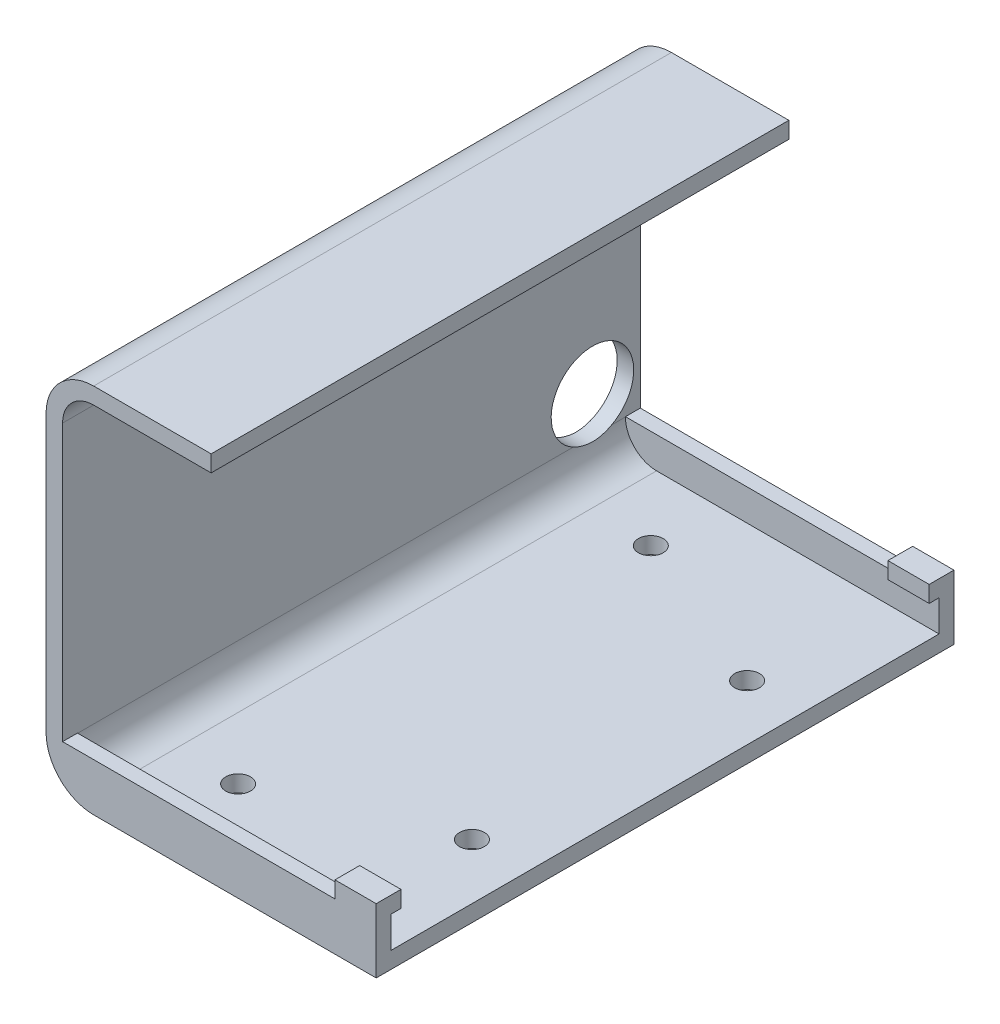
ISO-10303-21;
HEADER;
FILE_DESCRIPTION(('STEP AP214'),'2;1');
FILE_NAME('part.step','',(''),(''),'','','');
FILE_SCHEMA(('AUTOMOTIVE_DESIGN { 1 0 10303 214 1 1 1 1 }'));
ENDSEC;
DATA;
#1=APPLICATION_CONTEXT('core data for automotive mechanical design processes');
#2=APPLICATION_PROTOCOL_DEFINITION('international standard','automotive_design',2000,#1);
#3=PRODUCT_CONTEXT('',#1,'mechanical');
#4=PRODUCT('Part','Part','',(#3));
#5=PRODUCT_RELATED_PRODUCT_CATEGORY('part','',(#4));
#6=PRODUCT_DEFINITION_FORMATION('','',#4);
#7=PRODUCT_DEFINITION_CONTEXT('part definition',#1,'design');
#8=PRODUCT_DEFINITION('design','',#6,#7);
#9=PRODUCT_DEFINITION_SHAPE('','',#8);
#10=(LENGTH_UNIT() NAMED_UNIT(*) SI_UNIT(.MILLI.,.METRE.));
#11=(NAMED_UNIT(*) PLANE_ANGLE_UNIT() SI_UNIT($,.RADIAN.));
#12=(NAMED_UNIT(*) SI_UNIT($,.STERADIAN.) SOLID_ANGLE_UNIT());
#13=UNCERTAINTY_MEASURE_WITH_UNIT(LENGTH_MEASURE(1.E-05),#10,'distance_accuracy_value','');
#14=(GEOMETRIC_REPRESENTATION_CONTEXT(3) GLOBAL_UNCERTAINTY_ASSIGNED_CONTEXT((#13)) GLOBAL_UNIT_ASSIGNED_CONTEXT((#10,
#11,#12)) REPRESENTATION_CONTEXT('',''));
#15=CARTESIAN_POINT('',(0.,0.,0.));
#16=DIRECTION('',(0.,0.,1.));
#17=DIRECTION('',(1.,0.,0.));
#18=AXIS2_PLACEMENT_3D('',#15,#16,#17);
#19=CARTESIAN_POINT('',(-30.4002300884953,-13.4655752212389,0.));
#20=DIRECTION('',(0.,1.,0.));
#21=DIRECTION('',(0.,0.,1.));
#22=AXIS2_PLACEMENT_3D('',#19,#20,#21);
#23=PLANE('',#22);
#24=DIRECTION('',(1.,0.,0.));
#25=VECTOR('',#24,1.);
#26=CARTESIAN_POINT('',(-30.4002300884953,-13.4655752212389,1.8));
#27=LINE('',#26,#25);
#28=CARTESIAN_POINT('',(-28.3982300884955,-13.4655752212389,1.8));
#29=VERTEX_POINT('',#28);
#30=CARTESIAN_POINT('',(4.60176991150454,-13.4655752212389,1.8));
#31=VERTEX_POINT('',#30);
#32=EDGE_CURVE('E409',#29,#31,#27,.T.);
#33=ORIENTED_EDGE('',*,*,#32,.T.);
#34=DIRECTION('',(0.,0.,1.));
#35=VECTOR('',#34,1.);
#36=CARTESIAN_POINT('',(4.60176991150454,-13.4655752212389,0.));
#37=LINE('',#36,#35);
#38=CARTESIAN_POINT('',(4.60176991150455,-13.4655752212389,0.));
#39=VERTEX_POINT('',#38);
#40=EDGE_CURVE('E357',#39,#31,#37,.T.);
#41=ORIENTED_EDGE('',*,*,#40,.F.);
#42=DIRECTION('',(1.,0.,0.));
#43=VECTOR('',#42,1.);
#44=CARTESIAN_POINT('',(-30.4002300884953,-13.4655752212389,0.));
#45=LINE('',#44,#43);
#46=CARTESIAN_POINT('',(-28.3982300884955,-13.4655752212389,0.));
#47=VERTEX_POINT('',#46);
#48=EDGE_CURVE('E267',#47,#39,#45,.T.);
#49=ORIENTED_EDGE('',*,*,#48,.F.);
#50=DIRECTION('',(0.,0.,1.));
#51=VECTOR('',#50,1.);
#52=CARTESIAN_POINT('',(-28.3982300884955,-13.4655752212389,0.));
#53=LINE('',#52,#51);
#54=EDGE_CURVE('E262',#47,#29,#53,.T.);
#55=ORIENTED_EDGE('',*,*,#54,.T.);
#56=EDGE_LOOP('',(#33,#41,#49,#55));
#57=FACE_BOUND('',#56,.T.);
#58=ADVANCED_FACE('F33',(#57),#23,.T.);
#59=CARTESIAN_POINT('',(-30.4002300884953,-13.4655752212389,70.));
#60=DIRECTION('',(0.,1.,0.));
#61=DIRECTION('',(0.,0.,1.));
#62=AXIS2_PLACEMENT_3D('',#59,#60,#61);
#63=PLANE('',#62);
#64=DIRECTION('',(1.,0.,0.));
#65=VECTOR('',#64,1.);
#66=CARTESIAN_POINT('',(-30.4002300884953,-13.4655752212389,70.));
#67=LINE('',#66,#65);
#68=CARTESIAN_POINT('',(-28.3982300884955,-13.4655752212389,70.));
#69=VERTEX_POINT('',#68);
#70=CARTESIAN_POINT('',(4.60176991150454,-13.4655752212389,70.));
#71=VERTEX_POINT('',#70);
#72=EDGE_CURVE('E280',#69,#71,#67,.T.);
#73=ORIENTED_EDGE('',*,*,#72,.T.);
#74=DIRECTION('',(0.,0.,1.));
#75=VECTOR('',#74,1.);
#76=CARTESIAN_POINT('',(4.60176991150454,-13.4655752212389,70.));
#77=LINE('',#76,#75);
#78=CARTESIAN_POINT('',(4.60176991150454,-13.4655752212389,68.2));
#79=VERTEX_POINT('',#78);
#80=EDGE_CURVE('E394',#79,#71,#77,.T.);
#81=ORIENTED_EDGE('',*,*,#80,.F.);
#82=DIRECTION('',(1.,0.,0.));
#83=VECTOR('',#82,1.);
#84=CARTESIAN_POINT('',(-30.4002300884953,-13.4655752212389,68.2));
#85=LINE('',#84,#83);
#86=CARTESIAN_POINT('',(-28.3982300884955,-13.4655752212389,68.2));
#87=VERTEX_POINT('',#86);
#88=EDGE_CURVE('E283',#87,#79,#85,.T.);
#89=ORIENTED_EDGE('',*,*,#88,.F.);
#90=DIRECTION('',(0.,0.,1.));
#91=VECTOR('',#90,1.);
#92=CARTESIAN_POINT('',(-28.3982300884955,-13.4655752212389,70.));
#93=LINE('',#92,#91);
#94=EDGE_CURVE('E273',#87,#69,#93,.T.);
#95=ORIENTED_EDGE('',*,*,#94,.T.);
#96=EDGE_LOOP('',(#73,#81,#89,#95));
#97=FACE_BOUND('',#96,.T.);
#98=ADVANCED_FACE('F442',(#97),#63,.T.);
#99=CARTESIAN_POINT('',(9.60176991150455,-19.2655752212389,70.));
#100=DIRECTION('',(-1.,0.,0.));
#101=DIRECTION('',(0.,0.,1.));
#102=AXIS2_PLACEMENT_3D('',#99,#100,#101);
#103=PLANE('',#102);
#104=DIRECTION('',(0.,1.,0.));
#105=VECTOR('',#104,1.);
#106=CARTESIAN_POINT('',(9.60176991150455,-19.2655752212389,0.));
#107=LINE('',#106,#105);
#108=CARTESIAN_POINT('',(9.60176991150455,-19.2655752212389,0.));
#109=VERTEX_POINT('',#108);
#110=CARTESIAN_POINT('',(9.60176991150455,-11.4655752212389,0.));
#111=VERTEX_POINT('',#110);
#112=EDGE_CURVE('E279',#109,#111,#107,.T.);
#113=ORIENTED_EDGE('',*,*,#112,.T.);
#114=DIRECTION('',(0.,0.,-1.));
#115=VECTOR('',#114,1.);
#116=CARTESIAN_POINT('',(9.60176991150455,-11.4655752212389,0.));
#117=LINE('',#116,#115);
#118=CARTESIAN_POINT('',(9.60176991150455,-11.4655752212389,3.));
#119=VERTEX_POINT('',#118);
#120=EDGE_CURVE('E347',#119,#111,#117,.T.);
#121=ORIENTED_EDGE('',*,*,#120,.F.);
#122=DIRECTION('',(0.,-1.,0.));
#123=VECTOR('',#122,1.);
#124=CARTESIAN_POINT('',(9.60176991150455,-11.4655752212389,3.));
#125=LINE('',#124,#123);
#126=CARTESIAN_POINT('',(9.60176991150455,-13.4655752212389,3.));
#127=VERTEX_POINT('',#126);
#128=EDGE_CURVE('E350',#119,#127,#125,.T.);
#129=ORIENTED_EDGE('',*,*,#128,.T.);
#130=DIRECTION('',(0.,0.,-1.));
#131=VECTOR('',#130,1.);
#132=CARTESIAN_POINT('',(9.60176991150455,-13.4655752212389,0.));
#133=LINE('',#132,#131);
#134=CARTESIAN_POINT('',(9.60176991150455,-13.4655752212389,1.8));
#135=VERTEX_POINT('',#134);
#136=EDGE_CURVE('E366',#127,#135,#133,.T.);
#137=ORIENTED_EDGE('',*,*,#136,.T.);
#138=DIRECTION('',(0.,-1.,0.));
#139=VECTOR('',#138,1.);
#140=CARTESIAN_POINT('',(9.60176991150455,-17.2655752212389,1.8));
#141=LINE('',#140,#139);
#142=CARTESIAN_POINT('',(9.60176991150455,-17.2655752212389,1.8));
#143=VERTEX_POINT('',#142);
#144=EDGE_CURVE('E405',#135,#143,#141,.T.);
#145=ORIENTED_EDGE('',*,*,#144,.T.);
#146=DIRECTION('',(0.,0.,-1.));
#147=VECTOR('',#146,1.);
#148=CARTESIAN_POINT('',(9.60176991150455,-17.2655752212389,70.));
#149=LINE('',#148,#147);
#150=CARTESIAN_POINT('',(9.60176991150455,-17.2655752212389,68.2));
#151=VERTEX_POINT('',#150);
#152=EDGE_CURVE('E11',#151,#143,#149,.T.);
#153=ORIENTED_EDGE('',*,*,#152,.F.);
#154=DIRECTION('',(0.,1.,0.));
#155=VECTOR('',#154,1.);
#156=CARTESIAN_POINT('',(9.60176991150455,-17.2655752212389,68.2));
#157=LINE('',#156,#155);
#158=CARTESIAN_POINT('',(9.60176991150455,-13.4655752212389,68.2));
#159=VERTEX_POINT('',#158);
#160=EDGE_CURVE('E276',#151,#159,#157,.T.);
#161=ORIENTED_EDGE('',*,*,#160,.T.);
#162=DIRECTION('',(0.,0.,-1.));
#163=VECTOR('',#162,1.);
#164=CARTESIAN_POINT('',(9.60176991150455,-13.4655752212389,70.));
#165=LINE('',#164,#163);
#166=CARTESIAN_POINT('',(9.60176991150455,-13.4655752212389,67.));
#167=VERTEX_POINT('',#166);
#168=EDGE_CURVE('E378',#159,#167,#165,.T.);
#169=ORIENTED_EDGE('',*,*,#168,.T.);
#170=DIRECTION('',(0.,-1.,0.));
#171=VECTOR('',#170,1.);
#172=CARTESIAN_POINT('',(9.60176991150455,-11.4655752212389,67.));
#173=LINE('',#172,#171);
#174=CARTESIAN_POINT('',(9.60176991150455,-11.4655752212389,67.));
#175=VERTEX_POINT('',#174);
#176=EDGE_CURVE('E402',#175,#167,#173,.T.);
#177=ORIENTED_EDGE('',*,*,#176,.F.);
#178=DIRECTION('',(0.,0.,-1.));
#179=VECTOR('',#178,1.);
#180=CARTESIAN_POINT('',(9.60176991150455,-11.4655752212389,70.));
#181=LINE('',#180,#179);
#182=CARTESIAN_POINT('',(9.60176991150455,-11.4655752212389,70.));
#183=VERTEX_POINT('',#182);
#184=EDGE_CURVE('E379',#183,#175,#181,.T.);
#185=ORIENTED_EDGE('',*,*,#184,.F.);
#186=DIRECTION('',(0.,1.,0.));
#187=VECTOR('',#186,1.);
#188=CARTESIAN_POINT('',(9.60176991150455,-19.2655752212389,70.));
#189=LINE('',#188,#187);
#190=CARTESIAN_POINT('',(9.60176991150455,-19.2655752212389,70.));
#191=VERTEX_POINT('',#190);
#192=EDGE_CURVE('E288',#191,#183,#189,.T.);
#193=ORIENTED_EDGE('',*,*,#192,.F.);
#194=DIRECTION('',(0.,0.,-1.));
#195=VECTOR('',#194,1.);
#196=CARTESIAN_POINT('',(9.60176991150455,-19.2655752212389,70.));
#197=LINE('',#196,#195);
#198=EDGE_CURVE('E308',#191,#109,#197,.T.);
#199=ORIENTED_EDGE('',*,*,#198,.T.);
#200=EDGE_LOOP('',(#113,#121,#129,#137,#145,#153,#161,#169,#177,#185,#193,#199));
#201=FACE_BOUND('',#200,.T.);
#202=ADVANCED_FACE('F35',(#201),#103,.F.);
#203=CARTESIAN_POINT('',(-24.6282300884955,-17.2655752212389,70.));
#204=DIRECTION('',(0.,-1.,0.));
#205=DIRECTION('',(0.,0.,-1.));
#206=AXIS2_PLACEMENT_3D('',#203,#204,#205);
#207=PLANE('',#206);
#208=CARTESIAN_POINT('',(-17.1282300884954,-17.2655752212389,60.));
#209=DIRECTION('',(0.,-1.,0.));
#210=DIRECTION('',(0.,0.,-1.));
#211=AXIS2_PLACEMENT_3D('',#208,#209,#210);
#212=CIRCLE('',#211,1.5);
#213=CARTESIAN_POINT('',(-17.1282300884954,-17.2655752212389,58.5));
#214=VERTEX_POINT('',#213);
#215=EDGE_CURVE('E369',#214,#214,#212,.F.);
#216=ORIENTED_EDGE('',*,*,#215,.F.);
#217=EDGE_LOOP('',(#216));
#218=FACE_BOUND('',#217,.T.);
#219=CARTESIAN_POINT('',(2.87176991150455,-17.2655752212389,18.33));
#220=DIRECTION('',(0.,-1.,0.));
#221=DIRECTION('',(0.,0.,-1.));
#222=AXIS2_PLACEMENT_3D('',#219,#220,#221);
#223=CIRCLE('',#222,1.5);
#224=CARTESIAN_POINT('',(2.87176991150455,-17.2655752212389,16.83));
#225=VERTEX_POINT('',#224);
#226=EDGE_CURVE('E769',#225,#225,#223,.F.);
#227=ORIENTED_EDGE('',*,*,#226,.F.);
#228=EDGE_LOOP('',(#227));
#229=FACE_BOUND('',#228,.T.);
#230=CARTESIAN_POINT('',(2.87176991150455,-17.2655752212389,51.67));
#231=DIRECTION('',(0.,-1.,0.));
#232=DIRECTION('',(0.,0.,-1.));
#233=AXIS2_PLACEMENT_3D('',#230,#231,#232);
#234=CIRCLE('',#233,1.5);
#235=CARTESIAN_POINT('',(2.87176991150455,-17.2655752212389,50.17));
#236=VERTEX_POINT('',#235);
#237=EDGE_CURVE('E360',#236,#236,#234,.F.);
#238=ORIENTED_EDGE('',*,*,#237,.F.);
#239=EDGE_LOOP('',(#238));
#240=FACE_BOUND('',#239,.T.);
#241=CARTESIAN_POINT('',(-17.1282300884954,-17.2655752212389,10.));
#242=DIRECTION('',(0.,-1.,0.));
#243=DIRECTION('',(0.,0.,-1.));
#244=AXIS2_PLACEMENT_3D('',#241,#242,#243);
#245=CIRCLE('',#244,1.5);
#246=CARTESIAN_POINT('',(-17.1282300884954,-17.2655752212389,8.5));
#247=VERTEX_POINT('',#246);
#248=EDGE_CURVE('E775',#247,#247,#245,.F.);
#249=ORIENTED_EDGE('',*,*,#248,.F.);
#250=EDGE_LOOP('',(#249));
#251=FACE_BOUND('',#250,.T.);
#252=ORIENTED_EDGE('',*,*,#152,.T.);
#253=DIRECTION('',(1.,0.,0.));
#254=VECTOR('',#253,1.);
#255=CARTESIAN_POINT('',(-30.4002300884953,-17.2655752212389,1.8));
#256=LINE('',#255,#254);
#257=CARTESIAN_POINT('',(-24.6282300884955,-17.2655752212389,1.8));
#258=VERTEX_POINT('',#257);
#259=EDGE_CURVE('E258',#258,#143,#256,.T.);
#260=ORIENTED_EDGE('',*,*,#259,.F.);
#261=DIRECTION('',(0.,0.,-1.));
#262=VECTOR('',#261,1.);
#263=CARTESIAN_POINT('',(-24.6282300884955,-17.2655752212389,70.));
#264=LINE('',#263,#262);
#265=CARTESIAN_POINT('',(-24.6282300884955,-17.2655752212389,68.2));
#266=VERTEX_POINT('',#265);
#267=EDGE_CURVE('E41',#266,#258,#264,.T.);
#268=ORIENTED_EDGE('',*,*,#267,.F.);
#269=DIRECTION('',(1.,0.,0.));
#270=VECTOR('',#269,1.);
#271=CARTESIAN_POINT('',(-30.4002300884953,-17.2655752212389,68.2));
#272=LINE('',#271,#270);
#273=EDGE_CURVE('E275',#266,#151,#272,.T.);
#274=ORIENTED_EDGE('',*,*,#273,.T.);
#275=EDGE_LOOP('',(#252,#260,#268,#274));
#276=FACE_BOUND('',#275,.T.);
#277=ADVANCED_FACE('F425',(#218,#229,#240,#251,#276),#207,.F.);
#278=CARTESIAN_POINT('',(-24.6282300884955,-13.4955752212389,70.));
#279=DIRECTION('',(0.,0.,-1.));
#280=DIRECTION('',(-1.,0.,0.));
#281=AXIS2_PLACEMENT_3D('',#278,#279,#280);
#282=CYLINDRICAL_SURFACE('',#281,3.77);
#283=DIRECTION('',(0.,0.,-1.));
#284=VECTOR('',#283,1.);
#285=CARTESIAN_POINT('',(-28.3982300884955,-13.495575221239,70.));
#286=LINE('',#285,#284);
#287=CARTESIAN_POINT('',(-28.3982300884955,-13.495575221239,3.48157380967123));
#288=VERTEX_POINT('',#287);
#289=CARTESIAN_POINT('',(-28.3982300884955,-13.495575221239,1.8));
#290=VERTEX_POINT('',#289);
#291=EDGE_CURVE('E237',#288,#290,#286,.T.);
#292=ORIENTED_EDGE('',*,*,#291,.F.);
#293=CARTESIAN_POINT('',(-28.3982300884955,-13.4955752212389,8.11842619032883));
#294=CARTESIAN_POINT('',(-28.3982270925849,-13.5329839061099,8.0469465204507));
#295=CARTESIAN_POINT('',(-28.3976737369525,-13.5686546282551,7.97457569154834));
#296=CARTESIAN_POINT('',(-28.3957503176672,-13.6364479279596,7.82820827118018));
#297=CARTESIAN_POINT('',(-28.3943803223018,-13.6685708019244,7.75421181614778));
#298=CARTESIAN_POINT('',(-28.3894718258194,-13.7595057410542,7.53003158764738));
#299=CARTESIAN_POINT('',(-28.3851345778763,-13.8128996716182,7.37762722589878));
#300=CARTESIAN_POINT('',(-28.376260492181,-13.9045787019045,7.06882967974202));
#301=CARTESIAN_POINT('',(-28.371724228968,-13.9429044738165,6.91244846311666));
#302=CARTESIAN_POINT('',(-28.3638763128791,-14.0043105062385,6.59670763319707));
#303=CARTESIAN_POINT('',(-28.3605643929575,-14.0273940921363,6.43734867736293));
#304=CARTESIAN_POINT('',(-28.3563458061281,-14.0561353772264,6.13762455868667));
#305=CARTESIAN_POINT('',(-28.3551856647735,-14.0636443868979,5.99743723295872));
#306=CARTESIAN_POINT('',(-28.3546959175897,-14.0668520798259,5.71692660585075));
#307=CARTESIAN_POINT('',(-28.3553662228122,-14.062551336962,5.5766033114092));
#308=CARTESIAN_POINT('',(-28.3584085614522,-14.0421784010051,5.29695600951428));
#309=CARTESIAN_POINT('',(-28.3607790609137,-14.0261168185501,5.15763121555012));
#310=CARTESIAN_POINT('',(-28.3667335250392,-13.9823712810132,4.88089486437861));
#311=CARTESIAN_POINT('',(-28.3703172944029,-13.9546891963138,4.74348300295014));
#312=CARTESIAN_POINT('',(-28.3795751586933,-13.8733078305142,4.41216593684066));
#313=CARTESIAN_POINT('',(-28.3854800563474,-13.8135285565161,4.21970936348684));
#314=CARTESIAN_POINT('',(-28.3924702719276,-13.7068656230663,3.93759410397247));
#315=CARTESIAN_POINT('',(-28.39448916005,-13.6684787698263,3.84465022549217));
#316=CARTESIAN_POINT('',(-28.3973658913933,-13.5861561746786,3.66120388839466));
#317=CARTESIAN_POINT('',(-28.3982234018933,-13.5422188465655,3.57070213669266));
#318=CARTESIAN_POINT('',(-28.3982300884955,-13.4955752212389,3.48157380967117));
#319=B_SPLINE_CURVE_WITH_KNOTS('',3,(#293,#294,#295,#296,#297,#298,#299,#300,#301,#302,#303,
#304,#305,#306,#307,#308,#309,#310,#311,#312,#313,#314,#315,#316,#317,#318),.UNSPECIFIED.,.F.,
.F.,(4,2,2,2,2,2,2,2,2,2,2,2,4),(0.,0.241974503769225,0.48392877642466,0.967737118789775,
1.45023044277071,1.93261846636979,2.35330276719538,2.77396662577662,3.19425142800732,
3.61446860904911,4.21762328133169,4.51920325498638,4.82086960946777),.UNSPECIFIED.);
#320=CARTESIAN_POINT('',(-28.3982300884955,-13.495575221239,8.11842619032876));
#321=VERTEX_POINT('',#320);
#322=EDGE_CURVE('E47',#321,#288,#319,.T.);
#323=ORIENTED_EDGE('',*,*,#322,.F.);
#324=CARTESIAN_POINT('',(-28.3982300884955,-13.4955752212389,68.2));
#325=VERTEX_POINT('',#324);
#326=EDGE_CURVE('E238',#325,#321,#286,.T.);
#327=ORIENTED_EDGE('',*,*,#326,.F.);
#328=CARTESIAN_POINT('',(-24.6282300884955,-13.4955752212389,68.2));
#329=DIRECTION('',(0.,0.,-1.));
#330=DIRECTION('',(-1.,0.,0.));
#331=AXIS2_PLACEMENT_3D('',#328,#329,#330);
#332=CIRCLE('',#331,3.77);
#333=EDGE_CURVE('E251',#266,#325,#332,.T.);
#334=ORIENTED_EDGE('',*,*,#333,.F.);
#335=ORIENTED_EDGE('',*,*,#267,.T.);
#336=CARTESIAN_POINT('',(-24.6282300884955,-13.4955752212389,1.8));
#337=DIRECTION('',(0.,0.,1.));
#338=DIRECTION('',(1.,0.,0.));
#339=AXIS2_PLACEMENT_3D('',#336,#337,#338);
#340=CIRCLE('',#339,3.77);
#341=EDGE_CURVE('E248',#290,#258,#340,.T.);
#342=ORIENTED_EDGE('',*,*,#341,.F.);
#343=EDGE_LOOP('',(#292,#323,#327,#334,#335,#342));
#344=FACE_BOUND('',#343,.T.);
#345=ADVANCED_FACE('F247',(#344),#282,.F.);
#346=CARTESIAN_POINT('',(-28.3982300884954,19.9644247787611,70.));
#347=DIRECTION('',(-1.,0.,0.));
#348=DIRECTION('',(0.,-1.,0.));
#349=AXIS2_PLACEMENT_3D('',#346,#347,#348);
#350=PLANE('',#349);
#351=ORIENTED_EDGE('',*,*,#326,.T.);
#352=CARTESIAN_POINT('',(-28.3982300884955,-9.06557522123924,5.8));
#353=DIRECTION('',(-1.,0.,0.));
#354=DIRECTION('',(0.,-1.,0.));
#355=AXIS2_PLACEMENT_3D('',#352,#353,#354);
#356=CIRCLE('',#355,5.);
#357=EDGE_CURVE('E792',#288,#321,#356,.F.);
#358=ORIENTED_EDGE('',*,*,#357,.F.);
#359=ORIENTED_EDGE('',*,*,#291,.T.);
#360=DIRECTION('',(0.,-1.,0.));
#361=VECTOR('',#360,1.);
#362=CARTESIAN_POINT('',(-28.3982300884955,-17.2655752212389,1.8));
#363=LINE('',#362,#361);
#364=EDGE_CURVE('E261',#29,#290,#363,.T.);
#365=ORIENTED_EDGE('',*,*,#364,.F.);
#366=ORIENTED_EDGE('',*,*,#54,.F.);
#367=DIRECTION('',(0.,1.,0.));
#368=VECTOR('',#367,1.);
#369=CARTESIAN_POINT('',(-28.3982300884954,19.9644247787611,0.));
#370=LINE('',#369,#368);
#371=CARTESIAN_POINT('',(-28.3982300884954,19.9644247787611,0.));
#372=VERTEX_POINT('',#371);
#373=EDGE_CURVE('E310',#47,#372,#370,.T.);
#374=ORIENTED_EDGE('',*,*,#373,.T.);
#375=DIRECTION('',(0.,0.,-1.));
#376=VECTOR('',#375,1.);
#377=CARTESIAN_POINT('',(-28.3982300884954,19.9644247787611,70.));
#378=LINE('',#377,#376);
#379=CARTESIAN_POINT('',(-28.3982300884954,19.9644247787611,70.));
#380=VERTEX_POINT('',#379);
#381=EDGE_CURVE('E234',#380,#372,#378,.T.);
#382=ORIENTED_EDGE('',*,*,#381,.F.);
#383=DIRECTION('',(0.,1.,0.));
#384=VECTOR('',#383,1.);
#385=CARTESIAN_POINT('',(-28.3982300884954,19.9644247787611,70.));
#386=LINE('',#385,#384);
#387=EDGE_CURVE('E290',#69,#380,#386,.T.);
#388=ORIENTED_EDGE('',*,*,#387,.F.);
#389=ORIENTED_EDGE('',*,*,#94,.F.);
#390=DIRECTION('',(0.,1.,0.));
#391=VECTOR('',#390,1.);
#392=CARTESIAN_POINT('',(-28.3982300884955,-17.2655752212389,68.2));
#393=LINE('',#392,#391);
#394=EDGE_CURVE('E265',#325,#87,#393,.T.);
#395=ORIENTED_EDGE('',*,*,#394,.F.);
#396=EDGE_LOOP('',(#351,#358,#359,#365,#366,#374,#382,#388,#389,#395));
#397=FACE_BOUND('',#396,.T.);
#398=ADVANCED_FACE('F451',(#397),#350,.F.);
#399=CARTESIAN_POINT('',(-24.6282300884955,19.9644247787611,70.));
#400=DIRECTION('',(0.,0.,-1.));
#401=DIRECTION('',(-1.,0.,0.));
#402=AXIS2_PLACEMENT_3D('',#399,#400,#401);
#403=CYLINDRICAL_SURFACE('',#402,3.77);
#404=CARTESIAN_POINT('',(-24.6282300884955,19.9644247787611,0.));
#405=DIRECTION('',(0.,0.,-1.));
#406=DIRECTION('',(-1.,0.,0.));
#407=AXIS2_PLACEMENT_3D('',#404,#405,#406);
#408=CIRCLE('',#407,3.77);
#409=CARTESIAN_POINT('',(-24.6282300884955,23.7344247787611,0.));
#410=VERTEX_POINT('',#409);
#411=EDGE_CURVE('E312',#372,#410,#408,.T.);
#412=ORIENTED_EDGE('',*,*,#411,.T.);
#413=DIRECTION('',(0.,0.,-1.));
#414=VECTOR('',#413,1.);
#415=CARTESIAN_POINT('',(-24.6282300884955,23.7344247787611,70.));
#416=LINE('',#415,#414);
#417=CARTESIAN_POINT('',(-24.6282300884955,23.7344247787611,70.));
#418=VERTEX_POINT('',#417);
#419=EDGE_CURVE('E231',#418,#410,#416,.T.);
#420=ORIENTED_EDGE('',*,*,#419,.F.);
#421=CARTESIAN_POINT('',(-24.6282300884955,19.9644247787611,70.));
#422=DIRECTION('',(0.,0.,-1.));
#423=DIRECTION('',(-1.,0.,0.));
#424=AXIS2_PLACEMENT_3D('',#421,#422,#423);
#425=CIRCLE('',#424,3.77);
#426=EDGE_CURVE('E293',#380,#418,#425,.T.);
#427=ORIENTED_EDGE('',*,*,#426,.F.);
#428=ORIENTED_EDGE('',*,*,#381,.T.);
#429=EDGE_LOOP('',(#412,#420,#427,#428));
#430=FACE_BOUND('',#429,.T.);
#431=ADVANCED_FACE('F455',(#430),#403,.F.);
#432=CARTESIAN_POINT('',(-10.3982300884955,23.7344247787611,70.));
#433=DIRECTION('',(0.,1.,0.));
#434=DIRECTION('',(-1.,0.,0.));
#435=AXIS2_PLACEMENT_3D('',#432,#433,#434);
#436=PLANE('',#435);
#437=DIRECTION('',(1.,0.,0.));
#438=VECTOR('',#437,1.);
#439=CARTESIAN_POINT('',(-10.3982300884955,23.7344247787611,0.));
#440=LINE('',#439,#438);
#441=CARTESIAN_POINT('',(-10.3982300884955,23.7344247787611,0.));
#442=VERTEX_POINT('',#441);
#443=EDGE_CURVE('E314',#410,#442,#440,.T.);
#444=ORIENTED_EDGE('',*,*,#443,.T.);
#445=DIRECTION('',(0.,0.,-1.));
#446=VECTOR('',#445,1.);
#447=CARTESIAN_POINT('',(-10.3982300884955,23.7344247787611,70.));
#448=LINE('',#447,#446);
#449=CARTESIAN_POINT('',(-10.3982300884955,23.7344247787611,70.));
#450=VERTEX_POINT('',#449);
#451=EDGE_CURVE('E228',#450,#442,#448,.T.);
#452=ORIENTED_EDGE('',*,*,#451,.F.);
#453=DIRECTION('',(1.,0.,0.));
#454=VECTOR('',#453,1.);
#455=CARTESIAN_POINT('',(-10.3982300884955,23.7344247787611,70.));
#456=LINE('',#455,#454);
#457=EDGE_CURVE('E295',#418,#450,#456,.T.);
#458=ORIENTED_EDGE('',*,*,#457,.F.);
#459=ORIENTED_EDGE('',*,*,#419,.T.);
#460=EDGE_LOOP('',(#444,#452,#458,#459));
#461=FACE_BOUND('',#460,.T.);
#462=ADVANCED_FACE('F461',(#461),#436,.F.);
#463=CARTESIAN_POINT('',(-10.3982300884955,25.7344247787611,70.));
#464=DIRECTION('',(-1.,0.,0.));
#465=DIRECTION('',(0.,0.,1.));
#466=AXIS2_PLACEMENT_3D('',#463,#464,#465);
#467=PLANE('',#466);
#468=DIRECTION('',(0.,1.,0.));
#469=VECTOR('',#468,1.);
#470=CARTESIAN_POINT('',(-10.3982300884955,25.7344247787611,0.));
#471=LINE('',#470,#469);
#472=CARTESIAN_POINT('',(-10.3982300884955,25.7344247787611,0.));
#473=VERTEX_POINT('',#472);
#474=EDGE_CURVE('E316',#442,#473,#471,.T.);
#475=ORIENTED_EDGE('',*,*,#474,.T.);
#476=DIRECTION('',(0.,0.,-1.));
#477=VECTOR('',#476,1.);
#478=CARTESIAN_POINT('',(-10.3982300884955,25.7344247787611,70.));
#479=LINE('',#478,#477);
#480=CARTESIAN_POINT('',(-10.3982300884955,25.7344247787611,70.));
#481=VERTEX_POINT('',#480);
#482=EDGE_CURVE('E225',#481,#473,#479,.T.);
#483=ORIENTED_EDGE('',*,*,#482,.F.);
#484=DIRECTION('',(0.,1.,0.));
#485=VECTOR('',#484,1.);
#486=CARTESIAN_POINT('',(-10.3982300884955,25.7344247787611,70.));
#487=LINE('',#486,#485);
#488=EDGE_CURVE('E297',#450,#481,#487,.T.);
#489=ORIENTED_EDGE('',*,*,#488,.F.);
#490=ORIENTED_EDGE('',*,*,#451,.T.);
#491=EDGE_LOOP('',(#475,#483,#489,#490));
#492=FACE_BOUND('',#491,.T.);
#493=ADVANCED_FACE('F465',(#492),#467,.F.);
#494=CARTESIAN_POINT('',(-10.3982300884955,25.7344247787611,70.));
#495=DIRECTION('',(0.,-1.,0.));
#496=DIRECTION('',(0.,0.,-1.));
#497=AXIS2_PLACEMENT_3D('',#494,#495,#496);
#498=PLANE('',#497);
#499=DIRECTION('',(-1.,0.,0.));
#500=VECTOR('',#499,1.);
#501=CARTESIAN_POINT('',(-10.3982300884955,25.7344247787611,0.));
#502=LINE('',#501,#500);
#503=CARTESIAN_POINT('',(-24.6282300884955,25.7344247787611,0.));
#504=VERTEX_POINT('',#503);
#505=EDGE_CURVE('E318',#473,#504,#502,.T.);
#506=ORIENTED_EDGE('',*,*,#505,.T.);
#507=DIRECTION('',(0.,0.,-1.));
#508=VECTOR('',#507,1.);
#509=CARTESIAN_POINT('',(-24.6282300884955,25.7344247787611,70.));
#510=LINE('',#509,#508);
#511=CARTESIAN_POINT('',(-24.6282300884955,25.7344247787611,70.));
#512=VERTEX_POINT('',#511);
#513=EDGE_CURVE('E217',#512,#504,#510,.T.);
#514=ORIENTED_EDGE('',*,*,#513,.F.);
#515=DIRECTION('',(-1.,0.,0.));
#516=VECTOR('',#515,1.);
#517=CARTESIAN_POINT('',(-10.3982300884955,25.7344247787611,70.));
#518=LINE('',#517,#516);
#519=EDGE_CURVE('E299',#481,#512,#518,.T.);
#520=ORIENTED_EDGE('',*,*,#519,.F.);
#521=ORIENTED_EDGE('',*,*,#482,.T.);
#522=EDGE_LOOP('',(#506,#514,#520,#521));
#523=FACE_BOUND('',#522,.T.);
#524=ADVANCED_FACE('F470',(#523),#498,.F.);
#525=CARTESIAN_POINT('',(-24.6282300884955,19.9644247787611,70.));
#526=DIRECTION('',(0.,0.,-1.));
#527=DIRECTION('',(-1.,0.,0.));
#528=AXIS2_PLACEMENT_3D('',#525,#526,#527);
#529=CYLINDRICAL_SURFACE('',#528,5.77000000000001);
#530=CARTESIAN_POINT('',(-24.6282300884955,19.9644247787611,0.));
#531=DIRECTION('',(0.,0.,1.));
#532=DIRECTION('',(-1.,0.,0.));
#533=AXIS2_PLACEMENT_3D('',#530,#531,#532);
#534=CIRCLE('',#533,5.77000000000001);
#535=CARTESIAN_POINT('',(-30.3982300884955,19.9644247787611,0.));
#536=VERTEX_POINT('',#535);
#537=EDGE_CURVE('E320',#504,#536,#534,.T.);
#538=ORIENTED_EDGE('',*,*,#537,.T.);
#539=DIRECTION('',(0.,0.,-1.));
#540=VECTOR('',#539,1.);
#541=CARTESIAN_POINT('',(-30.3982300884955,19.9644247787611,70.));
#542=LINE('',#541,#540);
#543=CARTESIAN_POINT('',(-30.3982300884955,19.9644247787611,70.));
#544=VERTEX_POINT('',#543);
#545=EDGE_CURVE('E214',#544,#536,#542,.T.);
#546=ORIENTED_EDGE('',*,*,#545,.F.);
#547=CARTESIAN_POINT('',(-24.6282300884955,19.9644247787611,70.));
#548=DIRECTION('',(0.,0.,1.));
#549=DIRECTION('',(-1.,0.,0.));
#550=AXIS2_PLACEMENT_3D('',#547,#548,#549);
#551=CIRCLE('',#550,5.77000000000001);
#552=EDGE_CURVE('E301',#512,#544,#551,.T.);
#553=ORIENTED_EDGE('',*,*,#552,.F.);
#554=ORIENTED_EDGE('',*,*,#513,.T.);
#555=EDGE_LOOP('',(#538,#546,#553,#554));
#556=FACE_BOUND('',#555,.T.);
#557=ADVANCED_FACE('F474',(#556),#529,.T.);
#558=CARTESIAN_POINT('',(-30.3982300884955,19.9644247787611,70.));
#559=DIRECTION('',(1.,0.,0.));
#560=DIRECTION('',(0.,1.,0.));
#561=AXIS2_PLACEMENT_3D('',#558,#559,#560);
#562=PLANE('',#561);
#563=DIRECTION('',(0.,0.,-1.));
#564=VECTOR('',#563,1.);
#565=CARTESIAN_POINT('',(-30.3982300884953,-13.495575221239,70.));
#566=LINE('',#565,#564);
#567=CARTESIAN_POINT('',(-30.3982300884953,-13.495575221239,3.48157380967121));
#568=VERTEX_POINT('',#567);
#569=CARTESIAN_POINT('',(-30.3982300884953,-13.495575221239,0.));
#570=VERTEX_POINT('',#569);
#571=EDGE_CURVE('E209',#568,#570,#566,.T.);
#572=ORIENTED_EDGE('',*,*,#571,.F.);
#573=CARTESIAN_POINT('',(-30.3982300884952,-9.06557522123926,5.8));
#574=DIRECTION('',(-1.,0.,0.));
#575=DIRECTION('',(0.,-1.,0.));
#576=AXIS2_PLACEMENT_3D('',#573,#574,#575);
#577=CIRCLE('',#576,5.);
#578=CARTESIAN_POINT('',(-30.3982300884952,-13.495575221239,8.11842619032877));
#579=VERTEX_POINT('',#578);
#580=EDGE_CURVE('E54',#579,#568,#577,.T.);
#581=ORIENTED_EDGE('',*,*,#580,.F.);
#582=CARTESIAN_POINT('',(-30.3982300884953,-13.495575221239,70.));
#583=VERTEX_POINT('',#582);
#584=EDGE_CURVE('E206',#583,#579,#566,.T.);
#585=ORIENTED_EDGE('',*,*,#584,.F.);
#586=DIRECTION('',(0.,-1.,0.));
#587=VECTOR('',#586,1.);
#588=CARTESIAN_POINT('',(-30.3982300884955,19.9644247787611,70.));
#589=LINE('',#588,#587);
#590=EDGE_CURVE('E303',#544,#583,#589,.T.);
#591=ORIENTED_EDGE('',*,*,#590,.F.);
#592=ORIENTED_EDGE('',*,*,#545,.T.);
#593=DIRECTION('',(0.,-1.,0.));
#594=VECTOR('',#593,1.);
#595=CARTESIAN_POINT('',(-30.3982300884955,19.9644247787611,0.));
#596=LINE('',#595,#594);
#597=EDGE_CURVE('E322',#536,#570,#596,.T.);
#598=ORIENTED_EDGE('',*,*,#597,.T.);
#599=EDGE_LOOP('',(#572,#581,#585,#591,#592,#598));
#600=FACE_BOUND('',#599,.T.);
#601=ADVANCED_FACE('F204',(#600),#562,.F.);
#602=CARTESIAN_POINT('',(-24.6282300884955,-13.4955752212389,70.));
#603=DIRECTION('',(0.,0.,-1.));
#604=DIRECTION('',(-1.,0.,0.));
#605=AXIS2_PLACEMENT_3D('',#602,#603,#604);
#606=CYLINDRICAL_SURFACE('',#605,5.76999999999987);
#607=ORIENTED_EDGE('',*,*,#584,.T.);
#608=CARTESIAN_POINT('',(-30.3982300884953,-13.495575221239,3.48157380967121));
#609=CARTESIAN_POINT('',(-30.3982042996185,-13.5607490842191,3.60607484388603));
#610=CARTESIAN_POINT('',(-30.3971245593536,-13.6206427788271,3.73332573309121));
#611=CARTESIAN_POINT('',(-30.3937501967343,-13.7295067501225,3.9923929336328));
#612=CARTESIAN_POINT('',(-30.3914556598826,-13.7784777952491,4.12420892304727));
#613=CARTESIAN_POINT('',(-30.3865475273781,-13.8650887054622,4.39132341816228));
#614=CARTESIAN_POINT('',(-30.3839343325576,-13.9027426036065,4.52661738325278));
#615=CARTESIAN_POINT('',(-30.37906659234,-13.9665422388198,4.79989665710722));
#616=CARTESIAN_POINT('',(-30.3768120407003,-13.9926881762072,4.93788191898026));
#617=CARTESIAN_POINT('',(-30.3731552515211,-14.0333024431938,5.21569563605627));
#618=CARTESIAN_POINT('',(-30.3717537603689,-14.0477605501167,5.35552559632488));
#619=CARTESIAN_POINT('',(-30.3700847389181,-14.0648553625453,5.63591292975094));
#620=CARTESIAN_POINT('',(-30.3698172013408,-14.067492143931,5.77647029823343));
#621=CARTESIAN_POINT('',(-30.3704673138147,-14.0609263278791,6.05726448872997));
#622=CARTESIAN_POINT('',(-30.3713846319726,-14.0517270458782,6.19750138948994));
#623=CARTESIAN_POINT('',(-30.3742258854484,-14.0215622305024,6.47668453855977));
#624=CARTESIAN_POINT('',(-30.3761497235689,-14.0005978332457,6.61563091017494));
#625=CARTESIAN_POINT('',(-30.3802930968297,-13.9507686444398,6.87215449324679));
#626=CARTESIAN_POINT('',(-30.3824347872057,-13.9233999897799,6.99002629411975));
#627=CARTESIAN_POINT('',(-30.3867849898007,-13.8601937591793,7.22346528141911));
#628=CARTESIAN_POINT('',(-30.3889934944434,-13.8243571403267,7.3390327266948));
#629=CARTESIAN_POINT('',(-30.3930031579564,-13.7443822227537,7.56731198669123));
#630=CARTESIAN_POINT('',(-30.3948041724668,-13.7002409921078,7.6800227768804));
#631=CARTESIAN_POINT('',(-30.3974108412895,-13.6038956153941,7.90197732658763));
#632=CARTESIAN_POINT('',(-30.3982163275203,-13.5516901094571,8.01122049761296));
#633=CARTESIAN_POINT('',(-30.3982300884953,-13.495575221239,8.11842619032879));
#634=B_SPLINE_CURVE_WITH_KNOTS('',3,(#608,#609,#610,#611,#612,#613,#614,#615,#616,#617,#618,
#619,#620,#621,#622,#623,#624,#625,#626,#627,#628,#629,#630,#631,#632,#633),.UNSPECIFIED.,.F.,
.F.,(4,2,2,2,2,2,2,2,2,2,2,2,4),(0.,0.421438844561492,0.842848030350642,1.26373249986481,
1.68460964277785,2.10585450575953,2.52709666480071,2.94822085406669,3.36930438376158,
3.73207435811154,4.09480335012946,4.45766064397602,4.82057919294068),.UNSPECIFIED.);
#635=EDGE_CURVE('E196',#568,#579,#634,.T.);
#636=ORIENTED_EDGE('',*,*,#635,.F.);
#637=ORIENTED_EDGE('',*,*,#571,.T.);
#638=CARTESIAN_POINT('',(-24.6282300884955,-13.4955752212389,0.));
#639=DIRECTION('',(0.,0.,1.));
#640=DIRECTION('',(1.,0.,0.));
#641=AXIS2_PLACEMENT_3D('',#638,#639,#640);
#642=CIRCLE('',#641,5.76999999999987);
#643=CARTESIAN_POINT('',(-24.6282300884955,-19.2655752212389,0.));
#644=VERTEX_POINT('',#643);
#645=EDGE_CURVE('E324',#570,#644,#642,.T.);
#646=ORIENTED_EDGE('',*,*,#645,.T.);
#647=DIRECTION('',(0.,0.,-1.));
#648=VECTOR('',#647,1.);
#649=CARTESIAN_POINT('',(-24.6282300884955,-19.2655752212389,70.));
#650=LINE('',#649,#648);
#651=CARTESIAN_POINT('',(-24.6282300884955,-19.2655752212389,70.));
#652=VERTEX_POINT('',#651);
#653=EDGE_CURVE('E219',#652,#644,#650,.T.);
#654=ORIENTED_EDGE('',*,*,#653,.F.);
#655=CARTESIAN_POINT('',(-24.6282300884955,-13.4955752212389,70.));
#656=DIRECTION('',(0.,0.,1.));
#657=DIRECTION('',(1.,0.,0.));
#658=AXIS2_PLACEMENT_3D('',#655,#656,#657);
#659=CIRCLE('',#658,5.76999999999987);
#660=EDGE_CURVE('E213',#583,#652,#659,.T.);
#661=ORIENTED_EDGE('',*,*,#660,.F.);
#662=EDGE_LOOP('',(#607,#636,#637,#646,#654,#661));
#663=FACE_BOUND('',#662,.T.);
#664=ADVANCED_FACE('F211',(#663),#606,.T.);
#665=CARTESIAN_POINT('',(-24.6282300884955,-19.2655752212389,70.));
#666=DIRECTION('',(0.,1.,0.));
#667=DIRECTION('',(-1.,0.,0.));
#668=AXIS2_PLACEMENT_3D('',#665,#666,#667);
#669=PLANE('',#668);
#670=CARTESIAN_POINT('',(-17.1282300884955,-19.2655752212389,60.));
#671=DIRECTION('',(0.,-1.,0.));
#672=DIRECTION('',(1.,0.,0.));
#673=AXIS2_PLACEMENT_3D('',#670,#671,#672);
#674=CIRCLE('',#673,1.5);
#675=CARTESIAN_POINT('',(-15.6282300884955,-19.2655752212389,60.));
#676=VERTEX_POINT('',#675);
#677=EDGE_CURVE('E777',#676,#676,#674,.T.);
#678=ORIENTED_EDGE('',*,*,#677,.F.);
#679=EDGE_LOOP('',(#678));
#680=FACE_BOUND('',#679,.T.);
#681=CARTESIAN_POINT('',(2.87176991150455,-19.2655752212389,18.33));
#682=DIRECTION('',(0.,-1.,0.));
#683=DIRECTION('',(-1.,0.,0.));
#684=AXIS2_PLACEMENT_3D('',#681,#682,#683);
#685=CIRCLE('',#684,1.5);
#686=CARTESIAN_POINT('',(1.37176991150455,-19.2655752212389,18.33));
#687=VERTEX_POINT('',#686);
#688=EDGE_CURVE('E789',#687,#687,#685,.T.);
#689=ORIENTED_EDGE('',*,*,#688,.F.);
#690=EDGE_LOOP('',(#689));
#691=FACE_BOUND('',#690,.T.);
#692=CARTESIAN_POINT('',(2.87176991150455,-19.2655752212389,51.67));
#693=DIRECTION('',(0.,-1.,0.));
#694=DIRECTION('',(1.,0.,0.));
#695=AXIS2_PLACEMENT_3D('',#692,#693,#694);
#696=CIRCLE('',#695,1.5);
#697=CARTESIAN_POINT('',(4.37176991150455,-19.2655752212389,51.67));
#698=VERTEX_POINT('',#697);
#699=EDGE_CURVE('E786',#698,#698,#696,.T.);
#700=ORIENTED_EDGE('',*,*,#699,.F.);
#701=EDGE_LOOP('',(#700));
#702=FACE_BOUND('',#701,.T.);
#703=CARTESIAN_POINT('',(-17.1282300884955,-19.2655752212389,10.));
#704=DIRECTION('',(0.,-1.,0.));
#705=DIRECTION('',(-1.,0.,0.));
#706=AXIS2_PLACEMENT_3D('',#703,#704,#705);
#707=CIRCLE('',#706,1.5);
#708=CARTESIAN_POINT('',(-18.6282300884955,-19.2655752212389,10.));
#709=VERTEX_POINT('',#708);
#710=EDGE_CURVE('E778',#709,#709,#707,.T.);
#711=ORIENTED_EDGE('',*,*,#710,.F.);
#712=EDGE_LOOP('',(#711));
#713=FACE_BOUND('',#712,.T.);
#714=DIRECTION('',(1.,0.,0.));
#715=VECTOR('',#714,1.);
#716=CARTESIAN_POINT('',(-24.6282300884955,-19.2655752212389,0.));
#717=LINE('',#716,#715);
#718=EDGE_CURVE('E291',#644,#109,#717,.T.);
#719=ORIENTED_EDGE('',*,*,#718,.T.);
#720=ORIENTED_EDGE('',*,*,#198,.F.);
#721=DIRECTION('',(1.,0.,0.));
#722=VECTOR('',#721,1.);
#723=CARTESIAN_POINT('',(-24.6282300884955,-19.2655752212389,70.));
#724=LINE('',#723,#722);
#725=EDGE_CURVE('E306',#652,#191,#724,.T.);
#726=ORIENTED_EDGE('',*,*,#725,.F.);
#727=ORIENTED_EDGE('',*,*,#653,.T.);
#728=EDGE_LOOP('',(#719,#720,#726,#727));
#729=FACE_BOUND('',#728,.T.);
#730=ADVANCED_FACE('F335',(#680,#691,#702,#713,#729),#669,.F.);
#731=CARTESIAN_POINT('',(-24.6282300884955,-13.4955752212389,70.));
#732=DIRECTION('',(0.,0.,1.));
#733=DIRECTION('',(1.,0.,0.));
#734=AXIS2_PLACEMENT_3D('',#731,#732,#733);
#735=PLANE('',#734);
#736=ORIENTED_EDGE('',*,*,#72,.F.);
#737=ORIENTED_EDGE('',*,*,#387,.T.);
#738=ORIENTED_EDGE('',*,*,#426,.T.);
#739=ORIENTED_EDGE('',*,*,#457,.T.);
#740=ORIENTED_EDGE('',*,*,#488,.T.);
#741=ORIENTED_EDGE('',*,*,#519,.T.);
#742=ORIENTED_EDGE('',*,*,#552,.T.);
#743=ORIENTED_EDGE('',*,*,#590,.T.);
#744=ORIENTED_EDGE('',*,*,#660,.T.);
#745=ORIENTED_EDGE('',*,*,#725,.T.);
#746=ORIENTED_EDGE('',*,*,#192,.T.);
#747=DIRECTION('',(1.,0.,0.));
#748=VECTOR('',#747,1.);
#749=CARTESIAN_POINT('',(9.60176991150455,-11.4655752212389,70.));
#750=LINE('',#749,#748);
#751=CARTESIAN_POINT('',(4.60176991150454,-11.4655752212389,70.));
#752=VERTEX_POINT('',#751);
#753=EDGE_CURVE('E387',#752,#183,#750,.T.);
#754=ORIENTED_EDGE('',*,*,#753,.F.);
#755=DIRECTION('',(0.,-1.,0.));
#756=VECTOR('',#755,1.);
#757=CARTESIAN_POINT('',(4.60176991150454,-11.4655752212389,70.));
#758=LINE('',#757,#756);
#759=EDGE_CURVE('E390',#752,#71,#758,.T.);
#760=ORIENTED_EDGE('',*,*,#759,.T.);
#761=EDGE_LOOP('',(#736,#737,#738,#739,#740,#741,#742,#743,#744,#745,#746,#754,#760));
#762=FACE_BOUND('',#761,.T.);
#763=ADVANCED_FACE('F447',(#762),#735,.T.);
#764=CARTESIAN_POINT('',(-24.6282300884955,-13.4955752212389,0.));
#765=DIRECTION('',(0.,0.,1.));
#766=DIRECTION('',(1.,0.,0.));
#767=AXIS2_PLACEMENT_3D('',#764,#765,#766);
#768=PLANE('',#767);
#769=ORIENTED_EDGE('',*,*,#373,.F.);
#770=ORIENTED_EDGE('',*,*,#48,.T.);
#771=DIRECTION('',(0.,-1.,0.));
#772=VECTOR('',#771,1.);
#773=CARTESIAN_POINT('',(4.60176991150454,-11.4655752212389,0.));
#774=LINE('',#773,#772);
#775=CARTESIAN_POINT('',(4.60176991150454,-11.4655752212389,0.));
#776=VERTEX_POINT('',#775);
#777=EDGE_CURVE('E376',#776,#39,#774,.T.);
#778=ORIENTED_EDGE('',*,*,#777,.F.);
#779=DIRECTION('',(-1.,0.,0.));
#780=VECTOR('',#779,1.);
#781=CARTESIAN_POINT('',(9.60176991150455,-11.4655752212389,0.));
#782=LINE('',#781,#780);
#783=EDGE_CURVE('E343',#111,#776,#782,.T.);
#784=ORIENTED_EDGE('',*,*,#783,.F.);
#785=ORIENTED_EDGE('',*,*,#112,.F.);
#786=ORIENTED_EDGE('',*,*,#718,.F.);
#787=ORIENTED_EDGE('',*,*,#645,.F.);
#788=ORIENTED_EDGE('',*,*,#597,.F.);
#789=ORIENTED_EDGE('',*,*,#537,.F.);
#790=ORIENTED_EDGE('',*,*,#505,.F.);
#791=ORIENTED_EDGE('',*,*,#474,.F.);
#792=ORIENTED_EDGE('',*,*,#443,.F.);
#793=ORIENTED_EDGE('',*,*,#411,.F.);
#794=EDGE_LOOP('',(#769,#770,#778,#784,#785,#786,#787,#788,#789,#790,#791,#792,#793));
#795=FACE_BOUND('',#794,.T.);
#796=ADVANCED_FACE('F339',(#795),#768,.F.);
#797=CARTESIAN_POINT('',(-30.4002300884953,-17.2655752212389,68.2));
#798=DIRECTION('',(0.,0.,-1.));
#799=DIRECTION('',(-1.,0.,0.));
#800=AXIS2_PLACEMENT_3D('',#797,#798,#799);
#801=PLANE('',#800);
#802=ORIENTED_EDGE('',*,*,#333,.T.);
#803=ORIENTED_EDGE('',*,*,#394,.T.);
#804=ORIENTED_EDGE('',*,*,#88,.T.);
#805=EDGE_CURVE('E282',#79,#159,#85,.T.);
#806=ORIENTED_EDGE('',*,*,#805,.T.);
#807=ORIENTED_EDGE('',*,*,#160,.F.);
#808=ORIENTED_EDGE('',*,*,#273,.F.);
#809=EDGE_LOOP('',(#802,#803,#804,#806,#807,#808));
#810=FACE_BOUND('',#809,.T.);
#811=ADVANCED_FACE('F427',(#810),#801,.T.);
#812=CARTESIAN_POINT('',(-30.4002300884953,-17.2655752212389,1.8));
#813=DIRECTION('',(0.,0.,1.));
#814=DIRECTION('',(1.,0.,0.));
#815=AXIS2_PLACEMENT_3D('',#812,#813,#814);
#816=PLANE('',#815);
#817=ORIENTED_EDGE('',*,*,#364,.T.);
#818=ORIENTED_EDGE('',*,*,#341,.T.);
#819=ORIENTED_EDGE('',*,*,#259,.T.);
#820=ORIENTED_EDGE('',*,*,#144,.F.);
#821=EDGE_CURVE('E408',#31,#135,#27,.T.);
#822=ORIENTED_EDGE('',*,*,#821,.F.);
#823=ORIENTED_EDGE('',*,*,#32,.F.);
#824=EDGE_LOOP('',(#817,#818,#819,#820,#822,#823));
#825=FACE_BOUND('',#824,.T.);
#826=ADVANCED_FACE('F256',(#825),#816,.T.);
#827=CARTESIAN_POINT('',(9.60176991150455,-11.4655752212389,67.));
#828=DIRECTION('',(0.,0.,1.));
#829=DIRECTION('',(1.,0.,0.));
#830=AXIS2_PLACEMENT_3D('',#827,#828,#829);
#831=PLANE('',#830);
#832=DIRECTION('',(-1.,0.,0.));
#833=VECTOR('',#832,1.);
#834=CARTESIAN_POINT('',(9.60176991150455,-13.4655752212389,67.));
#835=LINE('',#834,#833);
#836=CARTESIAN_POINT('',(4.60176991150454,-13.4655752212389,67.));
#837=VERTEX_POINT('',#836);
#838=EDGE_CURVE('E392',#167,#837,#835,.T.);
#839=ORIENTED_EDGE('',*,*,#838,.T.);
#840=DIRECTION('',(0.,-1.,0.));
#841=VECTOR('',#840,1.);
#842=CARTESIAN_POINT('',(4.60176991150454,-11.4655752212389,67.));
#843=LINE('',#842,#841);
#844=CARTESIAN_POINT('',(4.60176991150454,-11.4655752212389,67.));
#845=VERTEX_POINT('',#844);
#846=EDGE_CURVE('E399',#845,#837,#843,.T.);
#847=ORIENTED_EDGE('',*,*,#846,.F.);
#848=DIRECTION('',(-1.,0.,0.));
#849=VECTOR('',#848,1.);
#850=CARTESIAN_POINT('',(9.60176991150455,-11.4655752212389,67.));
#851=LINE('',#850,#849);
#852=EDGE_CURVE('E382',#175,#845,#851,.T.);
#853=ORIENTED_EDGE('',*,*,#852,.F.);
#854=ORIENTED_EDGE('',*,*,#176,.T.);
#855=EDGE_LOOP('',(#839,#847,#853,#854));
#856=FACE_BOUND('',#855,.T.);
#857=ADVANCED_FACE('F598',(#856),#831,.F.);
#858=CARTESIAN_POINT('',(4.60176991150454,-11.4655752212389,70.));
#859=DIRECTION('',(1.,0.,0.));
#860=DIRECTION('',(0.,0.,-1.));
#861=AXIS2_PLACEMENT_3D('',#858,#859,#860);
#862=PLANE('',#861);
#863=EDGE_CURVE('E383',#837,#79,#77,.T.);
#864=ORIENTED_EDGE('',*,*,#863,.T.);
#865=ORIENTED_EDGE('',*,*,#80,.T.);
#866=ORIENTED_EDGE('',*,*,#759,.F.);
#867=DIRECTION('',(0.,0.,1.));
#868=VECTOR('',#867,1.);
#869=CARTESIAN_POINT('',(4.60176991150454,-11.4655752212389,70.));
#870=LINE('',#869,#868);
#871=EDGE_CURVE('E385',#845,#752,#870,.T.);
#872=ORIENTED_EDGE('',*,*,#871,.F.);
#873=ORIENTED_EDGE('',*,*,#846,.T.);
#874=EDGE_LOOP('',(#864,#865,#866,#872,#873));
#875=FACE_BOUND('',#874,.T.);
#876=ADVANCED_FACE('F437',(#875),#862,.F.);
#877=CARTESIAN_POINT('',(0.,-11.4655752212389,0.));
#878=DIRECTION('',(0.,1.,0.));
#879=DIRECTION('',(0.,0.,1.));
#880=AXIS2_PLACEMENT_3D('',#877,#878,#879);
#881=PLANE('',#880);
#882=ORIENTED_EDGE('',*,*,#184,.T.);
#883=ORIENTED_EDGE('',*,*,#852,.T.);
#884=ORIENTED_EDGE('',*,*,#871,.T.);
#885=ORIENTED_EDGE('',*,*,#753,.T.);
#886=EDGE_LOOP('',(#882,#883,#884,#885));
#887=FACE_BOUND('',#886,.T.);
#888=ADVANCED_FACE('F584',(#887),#881,.T.);
#889=CARTESIAN_POINT('',(0.,-13.4655752212389,0.));
#890=DIRECTION('',(0.,1.,0.));
#891=DIRECTION('',(0.,0.,1.));
#892=AXIS2_PLACEMENT_3D('',#889,#890,#891);
#893=PLANE('',#892);
#894=ORIENTED_EDGE('',*,*,#805,.F.);
#895=ORIENTED_EDGE('',*,*,#863,.F.);
#896=ORIENTED_EDGE('',*,*,#838,.F.);
#897=ORIENTED_EDGE('',*,*,#168,.F.);
#898=EDGE_LOOP('',(#894,#895,#896,#897));
#899=FACE_BOUND('',#898,.T.);
#900=ADVANCED_FACE('F433',(#899),#893,.F.);
#901=CARTESIAN_POINT('',(4.60176991150454,-11.4655752212389,0.));
#902=DIRECTION('',(1.,0.,0.));
#903=DIRECTION('',(0.,0.,-1.));
#904=AXIS2_PLACEMENT_3D('',#901,#902,#903);
#905=PLANE('',#904);
#906=ORIENTED_EDGE('',*,*,#40,.T.);
#907=CARTESIAN_POINT('',(4.60176991150454,-13.4655752212389,3.));
#908=VERTEX_POINT('',#907);
#909=EDGE_CURVE('E368',#31,#908,#37,.T.);
#910=ORIENTED_EDGE('',*,*,#909,.T.);
#911=DIRECTION('',(0.,-1.,0.));
#912=VECTOR('',#911,1.);
#913=CARTESIAN_POINT('',(4.60176991150454,-11.4655752212389,3.));
#914=LINE('',#913,#912);
#915=CARTESIAN_POINT('',(4.60176991150454,-11.4655752212389,3.));
#916=VERTEX_POINT('',#915);
#917=EDGE_CURVE('E373',#916,#908,#914,.T.);
#918=ORIENTED_EDGE('',*,*,#917,.F.);
#919=DIRECTION('',(0.,0.,1.));
#920=VECTOR('',#919,1.);
#921=CARTESIAN_POINT('',(4.60176991150454,-11.4655752212389,0.));
#922=LINE('',#921,#920);
#923=EDGE_CURVE('E355',#776,#916,#922,.T.);
#924=ORIENTED_EDGE('',*,*,#923,.F.);
#925=ORIENTED_EDGE('',*,*,#777,.T.);
#926=EDGE_LOOP('',(#906,#910,#918,#924,#925));
#927=FACE_BOUND('',#926,.T.);
#928=ADVANCED_FACE('F419',(#927),#905,.F.);
#929=CARTESIAN_POINT('',(9.60176991150455,-11.4655752212389,3.));
#930=DIRECTION('',(0.,0.,-1.));
#931=DIRECTION('',(-1.,0.,0.));
#932=AXIS2_PLACEMENT_3D('',#929,#930,#931);
#933=PLANE('',#932);
#934=DIRECTION('',(1.,0.,0.));
#935=VECTOR('',#934,1.);
#936=CARTESIAN_POINT('',(9.60176991150455,-13.4655752212389,3.));
#937=LINE('',#936,#935);
#938=EDGE_CURVE('E353',#908,#127,#937,.T.);
#939=ORIENTED_EDGE('',*,*,#938,.T.);
#940=ORIENTED_EDGE('',*,*,#128,.F.);
#941=DIRECTION('',(1.,0.,0.));
#942=VECTOR('',#941,1.);
#943=CARTESIAN_POINT('',(9.60176991150455,-11.4655752212389,3.));
#944=LINE('',#943,#942);
#945=EDGE_CURVE('E364',#916,#119,#944,.T.);
#946=ORIENTED_EDGE('',*,*,#945,.F.);
#947=ORIENTED_EDGE('',*,*,#917,.T.);
#948=EDGE_LOOP('',(#939,#940,#946,#947));
#949=FACE_BOUND('',#948,.T.);
#950=ADVANCED_FACE('F564',(#949),#933,.F.);
#951=CARTESIAN_POINT('',(0.,-11.4655752212389,0.));
#952=DIRECTION('',(0.,-1.,0.));
#953=DIRECTION('',(0.,0.,-1.));
#954=AXIS2_PLACEMENT_3D('',#951,#952,#953);
#955=PLANE('',#954);
#956=ORIENTED_EDGE('',*,*,#120,.T.);
#957=ORIENTED_EDGE('',*,*,#783,.T.);
#958=ORIENTED_EDGE('',*,*,#923,.T.);
#959=ORIENTED_EDGE('',*,*,#945,.T.);
#960=EDGE_LOOP('',(#956,#957,#958,#959));
#961=FACE_BOUND('',#960,.T.);
#962=ADVANCED_FACE('F556',(#961),#955,.F.);
#963=CARTESIAN_POINT('',(0.,-13.4655752212389,0.));
#964=DIRECTION('',(0.,-1.,0.));
#965=DIRECTION('',(0.,0.,-1.));
#966=AXIS2_PLACEMENT_3D('',#963,#964,#965);
#967=PLANE('',#966);
#968=ORIENTED_EDGE('',*,*,#909,.F.);
#969=ORIENTED_EDGE('',*,*,#821,.T.);
#970=ORIENTED_EDGE('',*,*,#136,.F.);
#971=ORIENTED_EDGE('',*,*,#938,.F.);
#972=EDGE_LOOP('',(#968,#969,#970,#971));
#973=FACE_BOUND('',#972,.T.);
#974=ADVANCED_FACE('F422',(#973),#967,.T.);
#975=CARTESIAN_POINT('',(-17.1282300884954,25.7354247787611,10.));
#976=DIRECTION('',(0.,-1.,0.));
#977=DIRECTION('',(1.,0.,0.));
#978=AXIS2_PLACEMENT_3D('',#975,#976,#977);
#979=CYLINDRICAL_SURFACE('',#978,1.5);
#980=ORIENTED_EDGE('',*,*,#710,.T.);
#981=EDGE_LOOP('',(#980));
#982=FACE_BOUND('',#981,.T.);
#983=ORIENTED_EDGE('',*,*,#248,.T.);
#984=EDGE_LOOP('',(#983));
#985=FACE_BOUND('',#984,.T.);
#986=ADVANCED_FACE('F540',(#982,#985),#979,.F.);
#987=CARTESIAN_POINT('',(2.87176991150456,25.7354247787611,51.67));
#988=DIRECTION('',(0.,-1.,0.));
#989=DIRECTION('',(1.,0.,0.));
#990=AXIS2_PLACEMENT_3D('',#987,#988,#989);
#991=CYLINDRICAL_SURFACE('',#990,1.5);
#992=ORIENTED_EDGE('',*,*,#699,.T.);
#993=EDGE_LOOP('',(#992));
#994=FACE_BOUND('',#993,.T.);
#995=ORIENTED_EDGE('',*,*,#237,.T.);
#996=EDGE_LOOP('',(#995));
#997=FACE_BOUND('',#996,.T.);
#998=ADVANCED_FACE('F532',(#994,#997),#991,.F.);
#999=CARTESIAN_POINT('',(2.87176991150456,25.7354247787611,18.33));
#1000=DIRECTION('',(0.,-1.,0.));
#1001=DIRECTION('',(1.,0.,0.));
#1002=AXIS2_PLACEMENT_3D('',#999,#1000,#1001);
#1003=CYLINDRICAL_SURFACE('',#1002,1.5);
#1004=ORIENTED_EDGE('',*,*,#688,.T.);
#1005=EDGE_LOOP('',(#1004));
#1006=FACE_BOUND('',#1005,.T.);
#1007=ORIENTED_EDGE('',*,*,#226,.T.);
#1008=EDGE_LOOP('',(#1007));
#1009=FACE_BOUND('',#1008,.T.);
#1010=ADVANCED_FACE('F524',(#1006,#1009),#1003,.F.);
#1011=CARTESIAN_POINT('',(-17.1282300884954,25.7354247787611,60.));
#1012=DIRECTION('',(0.,-1.,0.));
#1013=DIRECTION('',(1.,0.,0.));
#1014=AXIS2_PLACEMENT_3D('',#1011,#1012,#1013);
#1015=CYLINDRICAL_SURFACE('',#1014,1.5);
#1016=ORIENTED_EDGE('',*,*,#677,.T.);
#1017=EDGE_LOOP('',(#1016));
#1018=FACE_BOUND('',#1017,.T.);
#1019=ORIENTED_EDGE('',*,*,#215,.T.);
#1020=EDGE_LOOP('',(#1019));
#1021=FACE_BOUND('',#1020,.T.);
#1022=ADVANCED_FACE('F514',(#1018,#1021),#1015,.F.);
#1023=CARTESIAN_POINT('',(9.60276991150482,-9.06557522123894,5.8));
#1024=DIRECTION('',(-1.,0.,0.));
#1025=DIRECTION('',(0.,-1.,0.));
#1026=AXIS2_PLACEMENT_3D('',#1023,#1024,#1025);
#1027=CYLINDRICAL_SURFACE('',#1026,5.);
#1028=ORIENTED_EDGE('',*,*,#635,.T.);
#1029=ORIENTED_EDGE('',*,*,#580,.T.);
#1030=EDGE_LOOP('',(#1028,#1029));
#1031=FACE_BOUND('',#1030,.T.);
#1032=ORIENTED_EDGE('',*,*,#322,.T.);
#1033=ORIENTED_EDGE('',*,*,#357,.T.);
#1034=EDGE_LOOP('',(#1032,#1033));
#1035=FACE_BOUND('',#1034,.T.);
#1036=ADVANCED_FACE('F197',(#1031,#1035),#1027,.F.);
#1037=CLOSED_SHELL('',(#58,#98,#202,#277,#345,#398,#431,#462,#493,#524,#557,#601,#664,#730,#763,
#796,#811,#826,#857,#876,#888,#900,#928,#950,#962,#974,#986,#998,#1010,#1022,#1036));
#1038=MANIFOLD_SOLID_BREP('B2',#1037);
#1039=ADVANCED_BREP_SHAPE_REPRESENTATION('',(#18,#1038),#14);
#1040=SHAPE_DEFINITION_REPRESENTATION(#9,#1039);
ENDSEC;
END-ISO-10303-21;
